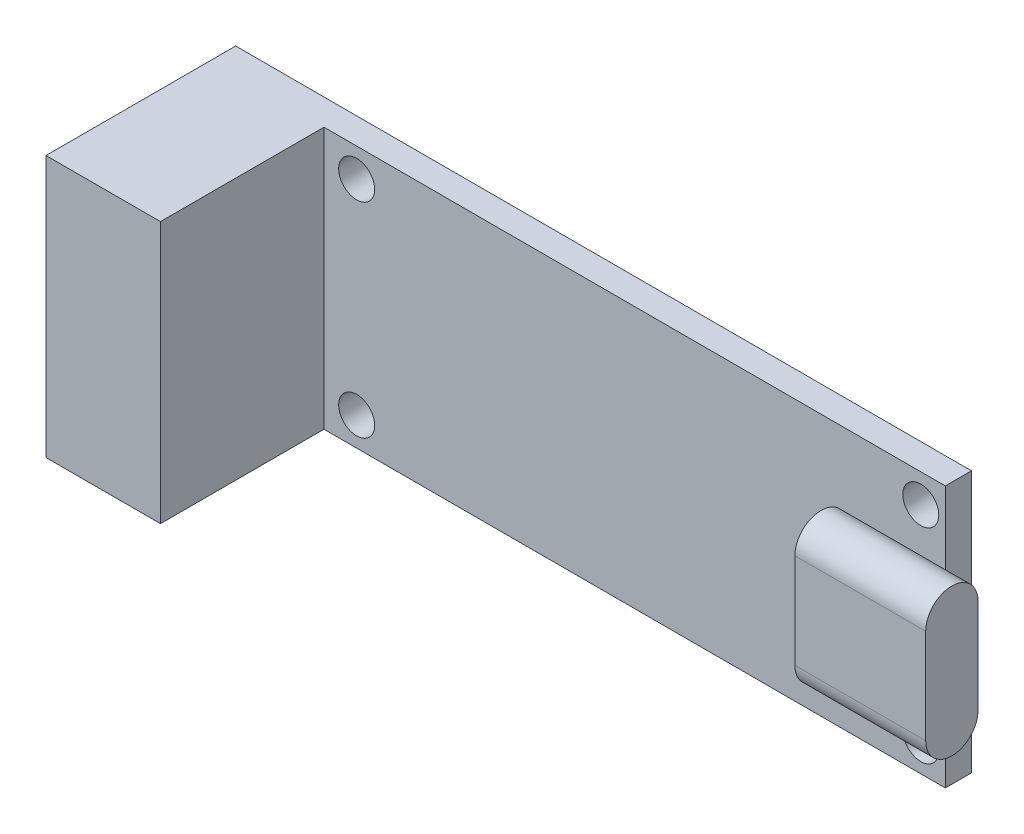
ISO-10303-21;
HEADER;
FILE_DESCRIPTION(('STEP AP214'),'2;1');
FILE_NAME('part.step','',(''),(''),'','','');
FILE_SCHEMA(('AUTOMOTIVE_DESIGN { 1 0 10303 214 1 1 1 1 }'));
ENDSEC;
DATA;
#1=APPLICATION_CONTEXT('core data for automotive mechanical design processes');
#2=APPLICATION_PROTOCOL_DEFINITION('international standard','automotive_design',2000,#1);
#3=PRODUCT_CONTEXT('',#1,'mechanical');
#4=PRODUCT('Part','Part','',(#3));
#5=PRODUCT_RELATED_PRODUCT_CATEGORY('part','',(#4));
#6=PRODUCT_DEFINITION_FORMATION('','',#4);
#7=PRODUCT_DEFINITION_CONTEXT('part definition',#1,'design');
#8=PRODUCT_DEFINITION('design','',#6,#7);
#9=PRODUCT_DEFINITION_SHAPE('','',#8);
#10=(LENGTH_UNIT() NAMED_UNIT(*) SI_UNIT(.MILLI.,.METRE.));
#11=(NAMED_UNIT(*) PLANE_ANGLE_UNIT() SI_UNIT($,.RADIAN.));
#12=(NAMED_UNIT(*) SI_UNIT($,.STERADIAN.) SOLID_ANGLE_UNIT());
#13=UNCERTAINTY_MEASURE_WITH_UNIT(LENGTH_MEASURE(1.E-05),#10,'distance_accuracy_value','');
#14=(GEOMETRIC_REPRESENTATION_CONTEXT(3) GLOBAL_UNCERTAINTY_ASSIGNED_CONTEXT((#13)) GLOBAL_UNIT_ASSIGNED_CONTEXT((#10,
#11,#12)) REPRESENTATION_CONTEXT('',''));
#15=CARTESIAN_POINT('',(0.,0.,0.));
#16=DIRECTION('',(0.,0.,1.));
#17=DIRECTION('',(1.,0.,0.));
#18=AXIS2_PLACEMENT_3D('',#15,#16,#17);
#19=CARTESIAN_POINT('',(0.,0.,1.6));
#20=DIRECTION('',(0.,0.,-1.));
#21=DIRECTION('',(-1.,0.,0.));
#22=AXIS2_PLACEMENT_3D('',#19,#20,#21);
#23=PLANE('',#22);
#24=CARTESIAN_POINT('',(43.5,1.75,1.6));
#25=DIRECTION('',(0.,0.,1.));
#26=DIRECTION('',(1.,0.,0.));
#27=AXIS2_PLACEMENT_3D('',#24,#25,#26);
#28=CIRCLE('',#27,1.10000000000001);
#29=CARTESIAN_POINT('',(44.6,1.75,1.6));
#30=VERTEX_POINT('',#29);
#31=EDGE_CURVE('E179',#30,#30,#28,.T.);
#32=ORIENTED_EDGE('',*,*,#31,.F.);
#33=EDGE_LOOP('',(#32));
#34=FACE_BOUND('',#33,.T.);
#35=CARTESIAN_POINT('',(43.5,14.25,1.6));
#36=DIRECTION('',(0.,0.,1.));
#37=DIRECTION('',(1.,0.,0.));
#38=AXIS2_PLACEMENT_3D('',#35,#36,#37);
#39=CIRCLE('',#38,1.10000000000001);
#40=CARTESIAN_POINT('',(44.6,14.25,1.6));
#41=VERTEX_POINT('',#40);
#42=EDGE_CURVE('E185',#41,#41,#39,.T.);
#43=ORIENTED_EDGE('',*,*,#42,.F.);
#44=EDGE_LOOP('',(#43));
#45=FACE_BOUND('',#44,.T.);
#46=CARTESIAN_POINT('',(9.,1.75,1.6));
#47=DIRECTION('',(0.,0.,1.));
#48=DIRECTION('',(1.,0.,0.));
#49=AXIS2_PLACEMENT_3D('',#46,#47,#48);
#50=CIRCLE('',#49,1.1);
#51=CARTESIAN_POINT('',(10.1,1.75,1.6));
#52=VERTEX_POINT('',#51);
#53=EDGE_CURVE('E191',#52,#52,#50,.T.);
#54=ORIENTED_EDGE('',*,*,#53,.F.);
#55=EDGE_LOOP('',(#54));
#56=FACE_BOUND('',#55,.T.);
#57=CARTESIAN_POINT('',(9.,14.25,1.6));
#58=DIRECTION('',(0.,0.,1.));
#59=DIRECTION('',(1.,0.,0.));
#60=AXIS2_PLACEMENT_3D('',#57,#58,#59);
#61=CIRCLE('',#60,1.1);
#62=CARTESIAN_POINT('',(10.1,14.25,1.6));
#63=VERTEX_POINT('',#62);
#64=EDGE_CURVE('E197',#63,#63,#61,.T.);
#65=ORIENTED_EDGE('',*,*,#64,.F.);
#66=EDGE_LOOP('',(#65));
#67=FACE_BOUND('',#66,.T.);
#68=DIRECTION('',(0.,1.,0.));
#69=VECTOR('',#68,1.);
#70=CARTESIAN_POINT('',(7.,16.,1.6));
#71=LINE('',#70,#69);
#72=CARTESIAN_POINT('',(7.,0.,1.6));
#73=VERTEX_POINT('',#72);
#74=CARTESIAN_POINT('',(7.,16.,1.6));
#75=VERTEX_POINT('',#74);
#76=EDGE_CURVE('E48',#73,#75,#71,.T.);
#77=ORIENTED_EDGE('',*,*,#76,.F.);
#78=DIRECTION('',(1.,0.,0.));
#79=VECTOR('',#78,1.);
#80=CARTESIAN_POINT('',(0.,0.,1.6));
#81=LINE('',#80,#79);
#82=CARTESIAN_POINT('',(45.,0.,1.6));
#83=VERTEX_POINT('',#82);
#84=EDGE_CURVE('E202',#73,#83,#81,.T.);
#85=ORIENTED_EDGE('',*,*,#84,.T.);
#86=DIRECTION('',(0.,1.,0.));
#87=VECTOR('',#86,1.);
#88=CARTESIAN_POINT('',(45.,0.,1.6));
#89=LINE('',#88,#87);
#90=CARTESIAN_POINT('',(45.,5.1,1.6));
#91=VERTEX_POINT('',#90);
#92=EDGE_CURVE('E206',#83,#91,#89,.T.);
#93=ORIENTED_EDGE('',*,*,#92,.T.);
#94=DIRECTION('',(1.,0.,0.));
#95=VECTOR('',#94,1.);
#96=CARTESIAN_POINT('',(39.,5.1,1.6));
#97=LINE('',#96,#95);
#98=CARTESIAN_POINT('',(39.,5.1,1.6));
#99=VERTEX_POINT('',#98);
#100=EDGE_CURVE('E172',#99,#91,#97,.T.);
#101=ORIENTED_EDGE('',*,*,#100,.F.);
#102=DIRECTION('',(0.,1.,0.));
#103=VECTOR('',#102,1.);
#104=CARTESIAN_POINT('',(39.,10.9,1.6));
#105=LINE('',#104,#103);
#106=CARTESIAN_POINT('',(39.,10.9,1.6));
#107=VERTEX_POINT('',#106);
#108=EDGE_CURVE('E164',#99,#107,#105,.T.);
#109=ORIENTED_EDGE('',*,*,#108,.T.);
#110=DIRECTION('',(1.,0.,0.));
#111=VECTOR('',#110,1.);
#112=CARTESIAN_POINT('',(39.,10.9,1.6));
#113=LINE('',#112,#111);
#114=CARTESIAN_POINT('',(45.,10.9,1.6));
#115=VERTEX_POINT('',#114);
#116=EDGE_CURVE('E167',#107,#115,#113,.T.);
#117=ORIENTED_EDGE('',*,*,#116,.T.);
#118=CARTESIAN_POINT('',(45.,16.,1.6));
#119=VERTEX_POINT('',#118);
#120=EDGE_CURVE('E204',#115,#119,#89,.T.);
#121=ORIENTED_EDGE('',*,*,#120,.T.);
#122=DIRECTION('',(-1.,0.,0.));
#123=VECTOR('',#122,1.);
#124=CARTESIAN_POINT('',(0.,16.,1.6));
#125=LINE('',#124,#123);
#126=EDGE_CURVE('E53',#119,#75,#125,.T.);
#127=ORIENTED_EDGE('',*,*,#126,.T.);
#128=EDGE_LOOP('',(#77,#85,#93,#101,#109,#117,#121,#127));
#129=FACE_BOUND('',#128,.T.);
#130=ADVANCED_FACE('F33',(#34,#45,#56,#67,#129),#23,.F.);
#131=CARTESIAN_POINT('',(0.,0.,0.));
#132=DIRECTION('',(0.,0.,-1.));
#133=DIRECTION('',(-1.,0.,0.));
#134=AXIS2_PLACEMENT_3D('',#131,#132,#133);
#135=PLANE('',#134);
#136=CARTESIAN_POINT('',(43.5,14.25,0.));
#137=DIRECTION('',(0.,0.,1.));
#138=DIRECTION('',(1.,0.,0.));
#139=AXIS2_PLACEMENT_3D('',#136,#137,#138);
#140=CIRCLE('',#139,1.10000000000001);
#141=CARTESIAN_POINT('',(44.6,14.25,0.));
#142=VERTEX_POINT('',#141);
#143=EDGE_CURVE('E182',#142,#142,#140,.T.);
#144=ORIENTED_EDGE('',*,*,#143,.T.);
#145=EDGE_LOOP('',(#144));
#146=FACE_BOUND('',#145,.T.);
#147=CARTESIAN_POINT('',(9.,14.25,0.));
#148=DIRECTION('',(0.,0.,1.));
#149=DIRECTION('',(1.,0.,0.));
#150=AXIS2_PLACEMENT_3D('',#147,#148,#149);
#151=CIRCLE('',#150,1.1);
#152=CARTESIAN_POINT('',(10.1,14.25,0.));
#153=VERTEX_POINT('',#152);
#154=EDGE_CURVE('E194',#153,#153,#151,.T.);
#155=ORIENTED_EDGE('',*,*,#154,.T.);
#156=EDGE_LOOP('',(#155));
#157=FACE_BOUND('',#156,.T.);
#158=DIRECTION('',(0.,-1.,0.));
#159=VECTOR('',#158,1.);
#160=CARTESIAN_POINT('',(0.,0.,0.));
#161=LINE('',#160,#159);
#162=CARTESIAN_POINT('',(0.,16.,0.));
#163=VERTEX_POINT('',#162);
#164=CARTESIAN_POINT('',(0.,0.,0.));
#165=VERTEX_POINT('',#164);
#166=EDGE_CURVE('E119',#163,#165,#161,.T.);
#167=ORIENTED_EDGE('',*,*,#166,.F.);
#168=DIRECTION('',(-1.,0.,0.));
#169=VECTOR('',#168,1.);
#170=CARTESIAN_POINT('',(0.,16.,0.));
#171=LINE('',#170,#169);
#172=CARTESIAN_POINT('',(45.,16.,0.));
#173=VERTEX_POINT('',#172);
#174=EDGE_CURVE('E205',#173,#163,#171,.T.);
#175=ORIENTED_EDGE('',*,*,#174,.F.);
#176=DIRECTION('',(0.,1.,0.));
#177=VECTOR('',#176,1.);
#178=CARTESIAN_POINT('',(45.,0.,0.));
#179=LINE('',#178,#177);
#180=CARTESIAN_POINT('',(45.,0.,0.));
#181=VERTEX_POINT('',#180);
#182=EDGE_CURVE('E215',#181,#173,#179,.T.);
#183=ORIENTED_EDGE('',*,*,#182,.F.);
#184=DIRECTION('',(1.,0.,0.));
#185=VECTOR('',#184,1.);
#186=CARTESIAN_POINT('',(0.,0.,0.));
#187=LINE('',#186,#185);
#188=EDGE_CURVE('E213',#165,#181,#187,.T.);
#189=ORIENTED_EDGE('',*,*,#188,.F.);
#190=EDGE_LOOP('',(#167,#175,#183,#189));
#191=FACE_BOUND('',#190,.T.);
#192=CARTESIAN_POINT('',(9.,1.75,0.));
#193=DIRECTION('',(0.,0.,1.));
#194=DIRECTION('',(1.,0.,0.));
#195=AXIS2_PLACEMENT_3D('',#192,#193,#194);
#196=CIRCLE('',#195,1.1);
#197=CARTESIAN_POINT('',(10.1,1.75,0.));
#198=VERTEX_POINT('',#197);
#199=EDGE_CURVE('E188',#198,#198,#196,.T.);
#200=ORIENTED_EDGE('',*,*,#199,.T.);
#201=EDGE_LOOP('',(#200));
#202=FACE_BOUND('',#201,.T.);
#203=CARTESIAN_POINT('',(43.5,1.75,0.));
#204=DIRECTION('',(0.,0.,1.));
#205=DIRECTION('',(1.,0.,0.));
#206=AXIS2_PLACEMENT_3D('',#203,#204,#205);
#207=CIRCLE('',#206,1.10000000000001);
#208=CARTESIAN_POINT('',(44.6,1.75,0.));
#209=VERTEX_POINT('',#208);
#210=EDGE_CURVE('E170',#209,#209,#207,.T.);
#211=ORIENTED_EDGE('',*,*,#210,.T.);
#212=EDGE_LOOP('',(#211));
#213=FACE_BOUND('',#212,.T.);
#214=ADVANCED_FACE('F230',(#146,#157,#191,#202,#213),#135,.T.);
#215=CARTESIAN_POINT('',(0.,0.,1.6));
#216=DIRECTION('',(1.,0.,0.));
#217=DIRECTION('',(0.,0.,-1.));
#218=AXIS2_PLACEMENT_3D('',#215,#216,#217);
#219=PLANE('',#218);
#220=ORIENTED_EDGE('',*,*,#166,.T.);
#221=DIRECTION('',(0.,0.,-1.));
#222=VECTOR('',#221,1.);
#223=CARTESIAN_POINT('',(0.,0.,1.6));
#224=LINE('',#223,#222);
#225=CARTESIAN_POINT('',(0.,0.,11.6));
#226=VERTEX_POINT('',#225);
#227=EDGE_CURVE('E11',#226,#165,#224,.T.);
#228=ORIENTED_EDGE('',*,*,#227,.F.);
#229=DIRECTION('',(0.,-1.,0.));
#230=VECTOR('',#229,1.);
#231=CARTESIAN_POINT('',(0.,16.,11.6));
#232=LINE('',#231,#230);
#233=CARTESIAN_POINT('',(0.,16.,11.6));
#234=VERTEX_POINT('',#233);
#235=EDGE_CURVE('E117',#234,#226,#232,.T.);
#236=ORIENTED_EDGE('',*,*,#235,.F.);
#237=DIRECTION('',(0.,0.,-1.));
#238=VECTOR('',#237,1.);
#239=CARTESIAN_POINT('',(0.,16.,1.6));
#240=LINE('',#239,#238);
#241=EDGE_CURVE('E211',#234,#163,#240,.T.);
#242=ORIENTED_EDGE('',*,*,#241,.T.);
#243=EDGE_LOOP('',(#220,#228,#236,#242));
#244=FACE_BOUND('',#243,.T.);
#245=ADVANCED_FACE('F35',(#244),#219,.F.);
#246=CARTESIAN_POINT('',(0.,0.,1.6));
#247=DIRECTION('',(0.,1.,0.));
#248=DIRECTION('',(0.,0.,1.));
#249=AXIS2_PLACEMENT_3D('',#246,#247,#248);
#250=PLANE('',#249);
#251=ORIENTED_EDGE('',*,*,#188,.T.);
#252=DIRECTION('',(0.,0.,-1.));
#253=VECTOR('',#252,1.);
#254=CARTESIAN_POINT('',(45.,0.,1.6));
#255=LINE('',#254,#253);
#256=EDGE_CURVE('E41',#83,#181,#255,.T.);
#257=ORIENTED_EDGE('',*,*,#256,.F.);
#258=ORIENTED_EDGE('',*,*,#84,.F.);
#259=DIRECTION('',(0.,0.,-1.));
#260=VECTOR('',#259,1.);
#261=CARTESIAN_POINT('',(7.,0.,11.6));
#262=LINE('',#261,#260);
#263=CARTESIAN_POINT('',(7.,0.,11.6));
#264=VERTEX_POINT('',#263);
#265=EDGE_CURVE('E125',#264,#73,#262,.T.);
#266=ORIENTED_EDGE('',*,*,#265,.F.);
#267=DIRECTION('',(1.,0.,0.));
#268=VECTOR('',#267,1.);
#269=CARTESIAN_POINT('',(0.,0.,11.6));
#270=LINE('',#269,#268);
#271=EDGE_CURVE('E122',#226,#264,#270,.T.);
#272=ORIENTED_EDGE('',*,*,#271,.F.);
#273=ORIENTED_EDGE('',*,*,#227,.T.);
#274=EDGE_LOOP('',(#251,#257,#258,#266,#272,#273));
#275=FACE_BOUND('',#274,.T.);
#276=ADVANCED_FACE('F123',(#275),#250,.F.);
#277=CARTESIAN_POINT('',(45.,0.,1.6));
#278=DIRECTION('',(-1.,0.,0.));
#279=DIRECTION('',(0.,0.,1.));
#280=AXIS2_PLACEMENT_3D('',#277,#278,#279);
#281=PLANE('',#280);
#282=ORIENTED_EDGE('',*,*,#182,.T.);
#283=DIRECTION('',(0.,0.,-1.));
#284=VECTOR('',#283,1.);
#285=CARTESIAN_POINT('',(45.,16.,1.6));
#286=LINE('',#285,#284);
#287=EDGE_CURVE('E219',#119,#173,#286,.T.);
#288=ORIENTED_EDGE('',*,*,#287,.F.);
#289=ORIENTED_EDGE('',*,*,#120,.F.);
#290=EDGE_CURVE('E209',#91,#115,#89,.T.);
#291=ORIENTED_EDGE('',*,*,#290,.F.);
#292=ORIENTED_EDGE('',*,*,#92,.F.);
#293=ORIENTED_EDGE('',*,*,#256,.T.);
#294=EDGE_LOOP('',(#282,#288,#289,#291,#292,#293));
#295=FACE_BOUND('',#294,.T.);
#296=ADVANCED_FACE('F226',(#295),#281,.F.);
#297=CARTESIAN_POINT('',(0.,16.,1.6));
#298=DIRECTION('',(0.,-1.,0.));
#299=DIRECTION('',(0.,0.,-1.));
#300=AXIS2_PLACEMENT_3D('',#297,#298,#299);
#301=PLANE('',#300);
#302=ORIENTED_EDGE('',*,*,#174,.T.);
#303=ORIENTED_EDGE('',*,*,#241,.F.);
#304=DIRECTION('',(-1.,0.,0.));
#305=VECTOR('',#304,1.);
#306=CARTESIAN_POINT('',(0.,16.,11.6));
#307=LINE('',#306,#305);
#308=CARTESIAN_POINT('',(7.,16.,11.6));
#309=VERTEX_POINT('',#308);
#310=EDGE_CURVE('E133',#309,#234,#307,.T.);
#311=ORIENTED_EDGE('',*,*,#310,.F.);
#312=DIRECTION('',(0.,0.,-1.));
#313=VECTOR('',#312,1.);
#314=CARTESIAN_POINT('',(7.,16.,11.6));
#315=LINE('',#314,#313);
#316=EDGE_CURVE('E138',#309,#75,#315,.T.);
#317=ORIENTED_EDGE('',*,*,#316,.T.);
#318=ORIENTED_EDGE('',*,*,#126,.F.);
#319=ORIENTED_EDGE('',*,*,#287,.T.);
#320=EDGE_LOOP('',(#302,#303,#311,#317,#318,#319));
#321=FACE_BOUND('',#320,.T.);
#322=ADVANCED_FACE('F233',(#321),#301,.F.);
#323=CARTESIAN_POINT('',(9.,14.25,1.6));
#324=DIRECTION('',(0.,0.,-1.));
#325=DIRECTION('',(-1.,0.,0.));
#326=AXIS2_PLACEMENT_3D('',#323,#324,#325);
#327=CYLINDRICAL_SURFACE('',#326,1.1);
#328=ORIENTED_EDGE('',*,*,#64,.T.);
#329=EDGE_LOOP('',(#328));
#330=FACE_BOUND('',#329,.T.);
#331=ORIENTED_EDGE('',*,*,#154,.F.);
#332=EDGE_LOOP('',(#331));
#333=FACE_BOUND('',#332,.T.);
#334=ADVANCED_FACE('F276',(#330,#333),#327,.F.);
#335=CARTESIAN_POINT('',(9.,1.75,1.6));
#336=DIRECTION('',(0.,0.,-1.));
#337=DIRECTION('',(-1.,0.,0.));
#338=AXIS2_PLACEMENT_3D('',#335,#336,#337);
#339=CYLINDRICAL_SURFACE('',#338,1.1);
#340=ORIENTED_EDGE('',*,*,#53,.T.);
#341=EDGE_LOOP('',(#340));
#342=FACE_BOUND('',#341,.T.);
#343=ORIENTED_EDGE('',*,*,#199,.F.);
#344=EDGE_LOOP('',(#343));
#345=FACE_BOUND('',#344,.T.);
#346=ADVANCED_FACE('F302',(#342,#345),#339,.F.);
#347=CARTESIAN_POINT('',(43.5,14.25,1.6));
#348=DIRECTION('',(0.,0.,-1.));
#349=DIRECTION('',(-1.,0.,0.));
#350=AXIS2_PLACEMENT_3D('',#347,#348,#349);
#351=CYLINDRICAL_SURFACE('',#350,1.10000000000001);
#352=ORIENTED_EDGE('',*,*,#42,.T.);
#353=EDGE_LOOP('',(#352));
#354=FACE_BOUND('',#353,.T.);
#355=ORIENTED_EDGE('',*,*,#143,.F.);
#356=EDGE_LOOP('',(#355));
#357=FACE_BOUND('',#356,.T.);
#358=ADVANCED_FACE('F312',(#354,#357),#351,.F.);
#359=CARTESIAN_POINT('',(43.5,1.75,1.6));
#360=DIRECTION('',(0.,0.,-1.));
#361=DIRECTION('',(-1.,0.,0.));
#362=AXIS2_PLACEMENT_3D('',#359,#360,#361);
#363=CYLINDRICAL_SURFACE('',#362,1.10000000000001);
#364=ORIENTED_EDGE('',*,*,#31,.T.);
#365=EDGE_LOOP('',(#364));
#366=FACE_BOUND('',#365,.T.);
#367=ORIENTED_EDGE('',*,*,#210,.F.);
#368=EDGE_LOOP('',(#367));
#369=FACE_BOUND('',#368,.T.);
#370=ADVANCED_FACE('F321',(#366,#369),#363,.F.);
#371=CARTESIAN_POINT('',(39.,10.9,1.6));
#372=DIRECTION('',(0.,0.,-1.));
#373=DIRECTION('',(-1.,0.,0.));
#374=AXIS2_PLACEMENT_3D('',#371,#372,#373);
#375=PLANE('',#374);
#376=ORIENTED_EDGE('',*,*,#290,.T.);
#377=CARTESIAN_POINT('',(47.,10.9,1.6));
#378=VERTEX_POINT('',#377);
#379=EDGE_CURVE('E171',#115,#378,#113,.T.);
#380=ORIENTED_EDGE('',*,*,#379,.T.);
#381=DIRECTION('',(0.,1.,0.));
#382=VECTOR('',#381,1.);
#383=CARTESIAN_POINT('',(47.,10.9,1.6));
#384=LINE('',#383,#382);
#385=CARTESIAN_POINT('',(47.,5.1,1.6));
#386=VERTEX_POINT('',#385);
#387=EDGE_CURVE('E152',#386,#378,#384,.T.);
#388=ORIENTED_EDGE('',*,*,#387,.F.);
#389=EDGE_CURVE('E175',#91,#386,#97,.T.);
#390=ORIENTED_EDGE('',*,*,#389,.F.);
#391=EDGE_LOOP('',(#376,#380,#388,#390));
#392=FACE_BOUND('',#391,.T.);
#393=ADVANCED_FACE('F242',(#392),#375,.T.);
#394=CARTESIAN_POINT('',(39.,10.9,3.2));
#395=DIRECTION('',(1.,0.,0.));
#396=DIRECTION('',(0.,0.,-1.));
#397=AXIS2_PLACEMENT_3D('',#394,#395,#396);
#398=CYLINDRICAL_SURFACE('',#397,1.6);
#399=DIRECTION('',(1.,0.,0.));
#400=VECTOR('',#399,1.);
#401=CARTESIAN_POINT('',(39.,10.9,4.8));
#402=LINE('',#401,#400);
#403=CARTESIAN_POINT('',(39.,10.9,4.8));
#404=VERTEX_POINT('',#403);
#405=CARTESIAN_POINT('',(47.,10.9,4.8));
#406=VERTEX_POINT('',#405);
#407=EDGE_CURVE('E166',#404,#406,#402,.T.);
#408=ORIENTED_EDGE('',*,*,#407,.T.);
#409=CARTESIAN_POINT('',(47.,10.9,3.2));
#410=DIRECTION('',(1.,0.,0.));
#411=DIRECTION('',(0.,0.,-1.));
#412=AXIS2_PLACEMENT_3D('',#409,#410,#411);
#413=CIRCLE('',#412,1.6);
#414=EDGE_CURVE('E143',#378,#406,#413,.T.);
#415=ORIENTED_EDGE('',*,*,#414,.F.);
#416=ORIENTED_EDGE('',*,*,#379,.F.);
#417=ORIENTED_EDGE('',*,*,#116,.F.);
#418=CARTESIAN_POINT('',(39.,10.9,3.2));
#419=DIRECTION('',(1.,0.,0.));
#420=DIRECTION('',(0.,0.,-1.));
#421=AXIS2_PLACEMENT_3D('',#418,#419,#420);
#422=CIRCLE('',#421,1.6);
#423=EDGE_CURVE('E155',#107,#404,#422,.T.);
#424=ORIENTED_EDGE('',*,*,#423,.T.);
#425=EDGE_LOOP('',(#408,#415,#416,#417,#424));
#426=FACE_BOUND('',#425,.T.);
#427=ADVANCED_FACE('F245',(#426),#398,.T.);
#428=CARTESIAN_POINT('',(39.,5.1,3.2));
#429=DIRECTION('',(1.,0.,0.));
#430=DIRECTION('',(0.,0.,-1.));
#431=AXIS2_PLACEMENT_3D('',#428,#429,#430);
#432=CYLINDRICAL_SURFACE('',#431,1.6);
#433=ORIENTED_EDGE('',*,*,#100,.T.);
#434=ORIENTED_EDGE('',*,*,#389,.T.);
#435=CARTESIAN_POINT('',(47.,5.1,3.2));
#436=DIRECTION('',(1.,0.,0.));
#437=DIRECTION('',(0.,0.,-1.));
#438=AXIS2_PLACEMENT_3D('',#435,#436,#437);
#439=CIRCLE('',#438,1.6);
#440=CARTESIAN_POINT('',(47.,5.1,4.8));
#441=VERTEX_POINT('',#440);
#442=EDGE_CURVE('E149',#441,#386,#439,.T.);
#443=ORIENTED_EDGE('',*,*,#442,.F.);
#444=DIRECTION('',(1.,0.,0.));
#445=VECTOR('',#444,1.);
#446=CARTESIAN_POINT('',(39.,5.1,4.8));
#447=LINE('',#446,#445);
#448=CARTESIAN_POINT('',(39.,5.1,4.8));
#449=VERTEX_POINT('',#448);
#450=EDGE_CURVE('E176',#449,#441,#447,.T.);
#451=ORIENTED_EDGE('',*,*,#450,.F.);
#452=CARTESIAN_POINT('',(39.,5.1,3.2));
#453=DIRECTION('',(1.,0.,0.));
#454=DIRECTION('',(0.,0.,-1.));
#455=AXIS2_PLACEMENT_3D('',#452,#453,#454);
#456=CIRCLE('',#455,1.6);
#457=EDGE_CURVE('E161',#449,#99,#456,.T.);
#458=ORIENTED_EDGE('',*,*,#457,.T.);
#459=EDGE_LOOP('',(#433,#434,#443,#451,#458));
#460=FACE_BOUND('',#459,.T.);
#461=ADVANCED_FACE('F251',(#460),#432,.T.);
#462=CARTESIAN_POINT('',(39.,10.9,4.8));
#463=DIRECTION('',(0.,0.,1.));
#464=DIRECTION('',(1.,0.,0.));
#465=AXIS2_PLACEMENT_3D('',#462,#463,#464);
#466=PLANE('',#465);
#467=ORIENTED_EDGE('',*,*,#450,.T.);
#468=DIRECTION('',(0.,-1.,0.));
#469=VECTOR('',#468,1.);
#470=CARTESIAN_POINT('',(47.,10.9,4.8));
#471=LINE('',#470,#469);
#472=EDGE_CURVE('E146',#406,#441,#471,.T.);
#473=ORIENTED_EDGE('',*,*,#472,.F.);
#474=ORIENTED_EDGE('',*,*,#407,.F.);
#475=DIRECTION('',(0.,-1.,0.));
#476=VECTOR('',#475,1.);
#477=CARTESIAN_POINT('',(39.,10.9,4.8));
#478=LINE('',#477,#476);
#479=EDGE_CURVE('E158',#404,#449,#478,.T.);
#480=ORIENTED_EDGE('',*,*,#479,.T.);
#481=EDGE_LOOP('',(#467,#473,#474,#480));
#482=FACE_BOUND('',#481,.T.);
#483=ADVANCED_FACE('F363',(#482),#466,.T.);
#484=CARTESIAN_POINT('',(39.,10.9,3.2));
#485=DIRECTION('',(1.,0.,0.));
#486=DIRECTION('',(0.,0.,-1.));
#487=AXIS2_PLACEMENT_3D('',#484,#485,#486);
#488=PLANE('',#487);
#489=ORIENTED_EDGE('',*,*,#423,.F.);
#490=ORIENTED_EDGE('',*,*,#108,.F.);
#491=ORIENTED_EDGE('',*,*,#457,.F.);
#492=ORIENTED_EDGE('',*,*,#479,.F.);
#493=EDGE_LOOP('',(#489,#490,#491,#492));
#494=FACE_BOUND('',#493,.T.);
#495=ADVANCED_FACE('F263',(#494),#488,.F.);
#496=CARTESIAN_POINT('',(47.,10.9,3.2));
#497=DIRECTION('',(1.,0.,0.));
#498=DIRECTION('',(0.,0.,-1.));
#499=AXIS2_PLACEMENT_3D('',#496,#497,#498);
#500=PLANE('',#499);
#501=ORIENTED_EDGE('',*,*,#414,.T.);
#502=ORIENTED_EDGE('',*,*,#472,.T.);
#503=ORIENTED_EDGE('',*,*,#442,.T.);
#504=ORIENTED_EDGE('',*,*,#387,.T.);
#505=EDGE_LOOP('',(#501,#502,#503,#504));
#506=FACE_BOUND('',#505,.T.);
#507=ADVANCED_FACE('F248',(#506),#500,.T.);
#508=CARTESIAN_POINT('',(7.,16.,11.6));
#509=DIRECTION('',(-1.,0.,0.));
#510=DIRECTION('',(0.,-1.,0.));
#511=AXIS2_PLACEMENT_3D('',#508,#509,#510);
#512=PLANE('',#511);
#513=ORIENTED_EDGE('',*,*,#76,.T.);
#514=ORIENTED_EDGE('',*,*,#316,.F.);
#515=DIRECTION('',(0.,1.,0.));
#516=VECTOR('',#515,1.);
#517=CARTESIAN_POINT('',(7.,16.,11.6));
#518=LINE('',#517,#516);
#519=EDGE_CURVE('E128',#264,#309,#518,.T.);
#520=ORIENTED_EDGE('',*,*,#519,.F.);
#521=ORIENTED_EDGE('',*,*,#265,.T.);
#522=EDGE_LOOP('',(#513,#514,#520,#521));
#523=FACE_BOUND('',#522,.T.);
#524=ADVANCED_FACE('F254',(#523),#512,.F.);
#525=CARTESIAN_POINT('',(0.,0.,11.6));
#526=DIRECTION('',(0.,0.,1.));
#527=DIRECTION('',(1.,0.,0.));
#528=AXIS2_PLACEMENT_3D('',#525,#526,#527);
#529=PLANE('',#528);
#530=ORIENTED_EDGE('',*,*,#235,.T.);
#531=ORIENTED_EDGE('',*,*,#271,.T.);
#532=ORIENTED_EDGE('',*,*,#519,.T.);
#533=ORIENTED_EDGE('',*,*,#310,.T.);
#534=EDGE_LOOP('',(#530,#531,#532,#533));
#535=FACE_BOUND('',#534,.T.);
#536=ADVANCED_FACE('F131',(#535),#529,.T.);
#537=CLOSED_SHELL('',(#130,#214,#245,#276,#296,#322,#334,#346,#358,#370,#393,#427,#461,#483,
#495,#507,#524,#536));
#538=MANIFOLD_SOLID_BREP('B2',#537);
#539=ADVANCED_BREP_SHAPE_REPRESENTATION('',(#18,#538),#14);
#540=SHAPE_DEFINITION_REPRESENTATION(#9,#539);
ENDSEC;
END-ISO-10303-21;
